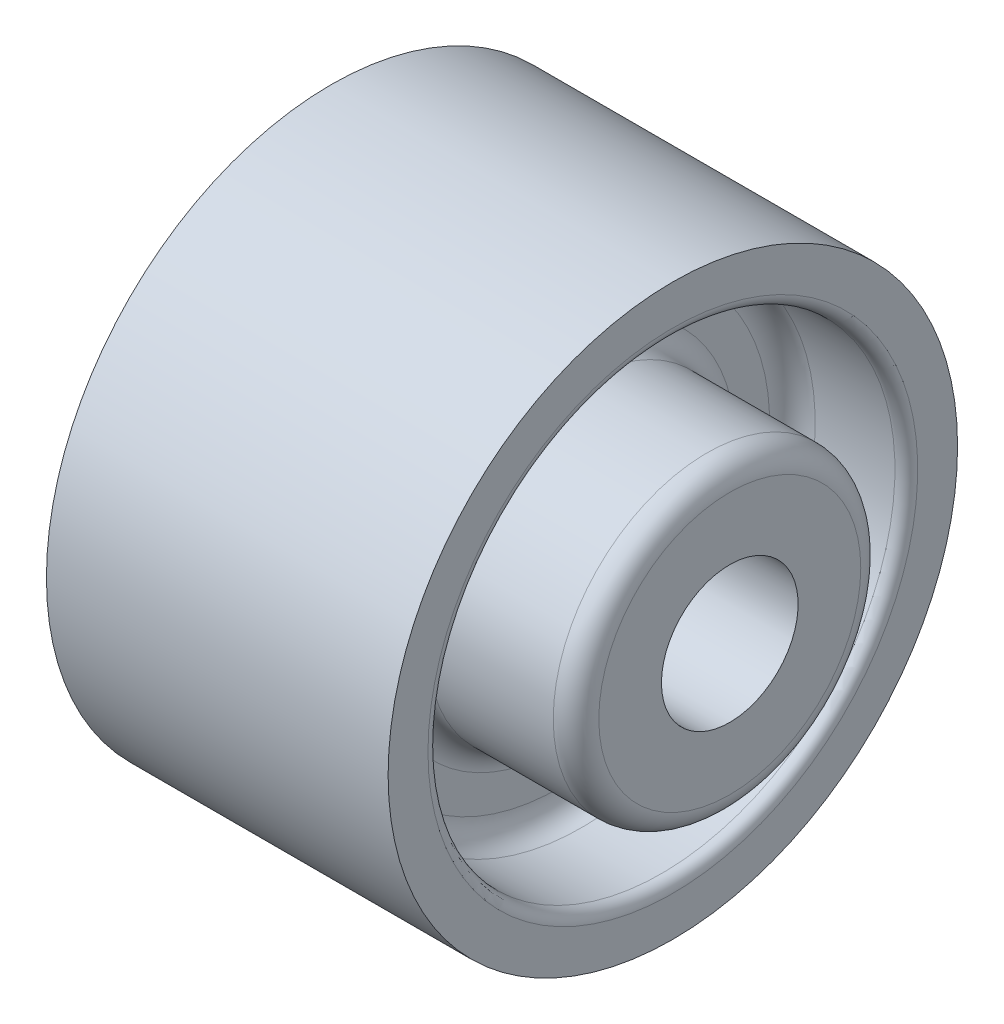
ISO-10303-21;
HEADER;
FILE_DESCRIPTION(('STEP AP214'),'2;1');
FILE_NAME('part.step','',(''),(''),'','','');
FILE_SCHEMA(('AUTOMOTIVE_DESIGN { 1 0 10303 214 1 1 1 1 }'));
ENDSEC;
DATA;
#1=APPLICATION_CONTEXT('core data for automotive mechanical design processes');
#2=APPLICATION_PROTOCOL_DEFINITION('international standard','automotive_design',2000,#1);
#3=PRODUCT_CONTEXT('',#1,'mechanical');
#4=PRODUCT('Part','Part','',(#3));
#5=PRODUCT_RELATED_PRODUCT_CATEGORY('part','',(#4));
#6=PRODUCT_DEFINITION_FORMATION('','',#4);
#7=PRODUCT_DEFINITION_CONTEXT('part definition',#1,'design');
#8=PRODUCT_DEFINITION('design','',#6,#7);
#9=PRODUCT_DEFINITION_SHAPE('','',#8);
#10=(LENGTH_UNIT() NAMED_UNIT(*) SI_UNIT(.MILLI.,.METRE.));
#11=(NAMED_UNIT(*) PLANE_ANGLE_UNIT() SI_UNIT($,.RADIAN.));
#12=(NAMED_UNIT(*) SI_UNIT($,.STERADIAN.) SOLID_ANGLE_UNIT());
#13=UNCERTAINTY_MEASURE_WITH_UNIT(LENGTH_MEASURE(1.E-05),#10,'distance_accuracy_value','');
#14=(GEOMETRIC_REPRESENTATION_CONTEXT(3) GLOBAL_UNCERTAINTY_ASSIGNED_CONTEXT((#13)) GLOBAL_UNIT_ASSIGNED_CONTEXT((#10,
#11,#12)) REPRESENTATION_CONTEXT('',''));
#15=CARTESIAN_POINT('',(0.,0.,0.));
#16=DIRECTION('',(0.,0.,1.));
#17=DIRECTION('',(1.,0.,0.));
#18=AXIS2_PLACEMENT_3D('',#15,#16,#17);
#19=CARTESIAN_POINT('',(-15.,25.,0.));
#20=DIRECTION('',(1.,0.,0.));
#21=DIRECTION('',(0.,0.,-1.));
#22=AXIS2_PLACEMENT_3D('',#19,#20,#21);
#23=PLANE('',#22);
#24=CARTESIAN_POINT('',(-15.,0.,0.));
#25=DIRECTION('',(-1.,0.,0.));
#26=DIRECTION('',(0.,0.,1.));
#27=AXIS2_PLACEMENT_3D('',#24,#25,#26);
#28=CIRCLE('',#27,21.5);
#29=CARTESIAN_POINT('',(-15.,0.,21.5));
#30=VERTEX_POINT('',#29);
#31=EDGE_CURVE('E10',#30,#30,#28,.T.);
#32=ORIENTED_EDGE('',*,*,#31,.F.);
#33=EDGE_LOOP('',(#32));
#34=FACE_BOUND('',#33,.T.);
#35=CARTESIAN_POINT('',(-15.,0.,0.));
#36=DIRECTION('',(-1.,0.,0.));
#37=DIRECTION('',(0.,0.,1.));
#38=AXIS2_PLACEMENT_3D('',#35,#36,#37);
#39=CIRCLE('',#38,25.);
#40=CARTESIAN_POINT('',(-15.,0.,25.));
#41=VERTEX_POINT('',#40);
#42=EDGE_CURVE('E96',#41,#41,#39,.T.);
#43=ORIENTED_EDGE('',*,*,#42,.T.);
#44=EDGE_LOOP('',(#43));
#45=FACE_BOUND('',#44,.T.);
#46=ADVANCED_FACE('F32',(#34,#45),#23,.F.);
#47=CARTESIAN_POINT('',(-14.,0.,0.));
#48=DIRECTION('',(-1.,0.,0.));
#49=DIRECTION('',(0.,0.,1.));
#50=AXIS2_PLACEMENT_3D('',#47,#48,#49);
#51=TOROIDAL_SURFACE('',#50,21.5,1.);
#52=CARTESIAN_POINT('',(-14.,0.,0.));
#53=DIRECTION('',(-1.,0.,0.));
#54=DIRECTION('',(0.,0.,1.));
#55=AXIS2_PLACEMENT_3D('',#52,#53,#54);
#56=CIRCLE('',#55,20.5);
#57=CARTESIAN_POINT('',(-14.,0.,20.5));
#58=VERTEX_POINT('',#57);
#59=EDGE_CURVE('E38',#58,#58,#56,.T.);
#60=ORIENTED_EDGE('',*,*,#59,.F.);
#61=EDGE_LOOP('',(#60));
#62=FACE_BOUND('',#61,.T.);
#63=ORIENTED_EDGE('',*,*,#31,.T.);
#64=EDGE_LOOP('',(#63));
#65=FACE_BOUND('',#64,.T.);
#66=ADVANCED_FACE('F205',(#62,#65),#51,.T.);
#67=CARTESIAN_POINT('',(-52.3821474865008,0.,0.));
#68=DIRECTION('',(-1.,0.,0.));
#69=DIRECTION('',(0.,0.,1.));
#70=AXIS2_PLACEMENT_3D('',#67,#68,#69);
#71=CYLINDRICAL_SURFACE('',#70,20.5);
#72=CARTESIAN_POINT('',(-7.38232719460137,0.,0.));
#73=DIRECTION('',(-1.,0.,0.));
#74=DIRECTION('',(0.,0.,1.));
#75=AXIS2_PLACEMENT_3D('',#72,#73,#74);
#76=CIRCLE('',#75,20.5);
#77=CARTESIAN_POINT('',(-7.38232719460137,0.,20.5));
#78=VERTEX_POINT('',#77);
#79=EDGE_CURVE('E42',#78,#78,#76,.T.);
#80=ORIENTED_EDGE('',*,*,#79,.F.);
#81=EDGE_LOOP('',(#80));
#82=FACE_BOUND('',#81,.T.);
#83=ORIENTED_EDGE('',*,*,#59,.T.);
#84=EDGE_LOOP('',(#83));
#85=FACE_BOUND('',#84,.T.);
#86=ADVANCED_FACE('F200',(#82,#85),#71,.F.);
#87=CARTESIAN_POINT('',(-7.38232719460137,0.,0.));
#88=DIRECTION('',(-1.,0.,0.));
#89=DIRECTION('',(0.,0.,1.));
#90=AXIS2_PLACEMENT_3D('',#87,#88,#89);
#91=TOROIDAL_SURFACE('',#90,18.5,2.);
#92=CARTESIAN_POINT('',(-5.41254255146046,0.,0.));
#93=DIRECTION('',(-1.,0.,0.));
#94=DIRECTION('',(0.,0.,1.));
#95=AXIS2_PLACEMENT_3D('',#92,#93,#94);
#96=CIRCLE('',#95,18.1536642385686);
#97=CARTESIAN_POINT('',(-5.41254255146046,0.,18.1536642385686));
#98=VERTEX_POINT('',#97);
#99=EDGE_CURVE('E46',#98,#98,#96,.T.);
#100=ORIENTED_EDGE('',*,*,#99,.F.);
#101=EDGE_LOOP('',(#100));
#102=FACE_BOUND('',#101,.T.);
#103=ORIENTED_EDGE('',*,*,#79,.T.);
#104=EDGE_LOOP('',(#103));
#105=FACE_BOUND('',#104,.T.);
#106=ADVANCED_FACE('F194',(#102,#105),#91,.F.);
#107=CARTESIAN_POINT('',(-5.41254255146046,0.,0.));
#108=DIRECTION('',(1.,0.,0.));
#109=DIRECTION('',(0.,0.,-1.));
#110=AXIS2_PLACEMENT_3D('',#107,#108,#109);
#111=CONICAL_SURFACE('',#110,18.1536642385686,1.39675108695216);
#112=CARTESIAN_POINT('',(-5.94001507893299,0.,0.));
#113=DIRECTION('',(-1.,0.,0.));
#114=DIRECTION('',(0.,0.,1.));
#115=AXIS2_PLACEMENT_3D('',#112,#113,#114);
#116=CIRCLE('',#115,15.1536642385686);
#117=CARTESIAN_POINT('',(-5.94001507893299,0.,15.1536642385686));
#118=VERTEX_POINT('',#117);
#119=EDGE_CURVE('E51',#118,#118,#116,.T.);
#120=ORIENTED_EDGE('',*,*,#119,.F.);
#121=EDGE_LOOP('',(#120));
#122=FACE_BOUND('',#121,.T.);
#123=ORIENTED_EDGE('',*,*,#99,.T.);
#124=EDGE_LOOP('',(#123));
#125=FACE_BOUND('',#124,.T.);
#126=ADVANCED_FACE('F188',(#122,#125),#111,.T.);
#127=CARTESIAN_POINT('',(-7.9097997220739,0.,0.));
#128=DIRECTION('',(-1.,0.,0.));
#129=DIRECTION('',(0.,0.,1.));
#130=AXIS2_PLACEMENT_3D('',#127,#128,#129);
#131=TOROIDAL_SURFACE('',#130,15.5,2.);
#132=CARTESIAN_POINT('',(-7.9097997220739,0.,0.));
#133=DIRECTION('',(-1.,0.,0.));
#134=DIRECTION('',(0.,0.,1.));
#135=AXIS2_PLACEMENT_3D('',#132,#133,#134);
#136=CIRCLE('',#135,13.5);
#137=CARTESIAN_POINT('',(-7.9097997220739,0.,13.5));
#138=VERTEX_POINT('',#137);
#139=EDGE_CURVE('E54',#138,#138,#136,.T.);
#140=ORIENTED_EDGE('',*,*,#139,.F.);
#141=EDGE_LOOP('',(#140));
#142=FACE_BOUND('',#141,.T.);
#143=ORIENTED_EDGE('',*,*,#119,.T.);
#144=EDGE_LOOP('',(#143));
#145=FACE_BOUND('',#144,.T.);
#146=ADVANCED_FACE('F182',(#142,#145),#131,.F.);
#147=CARTESIAN_POINT('',(-52.3821474865008,0.,0.));
#148=DIRECTION('',(-1.,0.,0.));
#149=DIRECTION('',(0.,0.,1.));
#150=AXIS2_PLACEMENT_3D('',#147,#148,#149);
#151=CYLINDRICAL_SURFACE('',#150,13.5);
#152=CARTESIAN_POINT('',(-18.,0.,0.));
#153=DIRECTION('',(-1.,0.,0.));
#154=DIRECTION('',(0.,0.,1.));
#155=AXIS2_PLACEMENT_3D('',#152,#153,#154);
#156=CIRCLE('',#155,13.5);
#157=CARTESIAN_POINT('',(-18.,0.,13.5));
#158=VERTEX_POINT('',#157);
#159=EDGE_CURVE('E57',#158,#158,#156,.T.);
#160=ORIENTED_EDGE('',*,*,#159,.F.);
#161=EDGE_LOOP('',(#160));
#162=FACE_BOUND('',#161,.T.);
#163=ORIENTED_EDGE('',*,*,#139,.T.);
#164=EDGE_LOOP('',(#163));
#165=FACE_BOUND('',#164,.T.);
#166=ADVANCED_FACE('F176',(#162,#165),#151,.T.);
#167=CARTESIAN_POINT('',(-18.,0.,0.));
#168=DIRECTION('',(-1.,0.,0.));
#169=DIRECTION('',(0.,0.,1.));
#170=AXIS2_PLACEMENT_3D('',#167,#168,#169);
#171=TOROIDAL_SURFACE('',#170,11.5,2.);
#172=CARTESIAN_POINT('',(-20.,0.,0.));
#173=DIRECTION('',(-1.,0.,0.));
#174=DIRECTION('',(0.,0.,1.));
#175=AXIS2_PLACEMENT_3D('',#172,#173,#174);
#176=CIRCLE('',#175,11.5);
#177=CARTESIAN_POINT('',(-20.,0.,11.5));
#178=VERTEX_POINT('',#177);
#179=EDGE_CURVE('E60',#178,#178,#176,.T.);
#180=ORIENTED_EDGE('',*,*,#179,.F.);
#181=EDGE_LOOP('',(#180));
#182=FACE_BOUND('',#181,.T.);
#183=ORIENTED_EDGE('',*,*,#159,.T.);
#184=EDGE_LOOP('',(#183));
#185=FACE_BOUND('',#184,.T.);
#186=ADVANCED_FACE('F170',(#182,#185),#171,.T.);
#187=CARTESIAN_POINT('',(-20.,11.5,0.));
#188=DIRECTION('',(1.,0.,0.));
#189=DIRECTION('',(0.,0.,-1.));
#190=AXIS2_PLACEMENT_3D('',#187,#188,#189);
#191=PLANE('',#190);
#192=CARTESIAN_POINT('',(-20.,0.,0.));
#193=DIRECTION('',(-1.,0.,0.));
#194=DIRECTION('',(0.,0.,1.));
#195=AXIS2_PLACEMENT_3D('',#192,#193,#194);
#196=CIRCLE('',#195,6.);
#197=CARTESIAN_POINT('',(-20.,0.,6.));
#198=VERTEX_POINT('',#197);
#199=EDGE_CURVE('E63',#198,#198,#196,.T.);
#200=ORIENTED_EDGE('',*,*,#199,.F.);
#201=EDGE_LOOP('',(#200));
#202=FACE_BOUND('',#201,.T.);
#203=ORIENTED_EDGE('',*,*,#179,.T.);
#204=EDGE_LOOP('',(#203));
#205=FACE_BOUND('',#204,.T.);
#206=ADVANCED_FACE('F164',(#202,#205),#191,.F.);
#207=CARTESIAN_POINT('',(-52.3821474865008,0.,0.));
#208=DIRECTION('',(-1.,0.,0.));
#209=DIRECTION('',(0.,0.,1.));
#210=AXIS2_PLACEMENT_3D('',#207,#208,#209);
#211=CYLINDRICAL_SURFACE('',#210,6.);
#212=CARTESIAN_POINT('',(20.,0.,0.));
#213=DIRECTION('',(-1.,0.,0.));
#214=DIRECTION('',(0.,0.,1.));
#215=AXIS2_PLACEMENT_3D('',#212,#213,#214);
#216=CIRCLE('',#215,6.);
#217=CARTESIAN_POINT('',(20.,0.,6.));
#218=VERTEX_POINT('',#217);
#219=EDGE_CURVE('E66',#218,#218,#216,.T.);
#220=ORIENTED_EDGE('',*,*,#219,.F.);
#221=EDGE_LOOP('',(#220));
#222=FACE_BOUND('',#221,.T.);
#223=ORIENTED_EDGE('',*,*,#199,.T.);
#224=EDGE_LOOP('',(#223));
#225=FACE_BOUND('',#224,.T.);
#226=ADVANCED_FACE('F158',(#222,#225),#211,.F.);
#227=CARTESIAN_POINT('',(20.,6.,0.));
#228=DIRECTION('',(-1.,0.,0.));
#229=DIRECTION('',(0.,0.,1.));
#230=AXIS2_PLACEMENT_3D('',#227,#228,#229);
#231=PLANE('',#230);
#232=CARTESIAN_POINT('',(20.,0.,0.));
#233=DIRECTION('',(-1.,0.,0.));
#234=DIRECTION('',(0.,0.,1.));
#235=AXIS2_PLACEMENT_3D('',#232,#233,#234);
#236=CIRCLE('',#235,11.5);
#237=CARTESIAN_POINT('',(20.,0.,11.5));
#238=VERTEX_POINT('',#237);
#239=EDGE_CURVE('E69',#238,#238,#236,.T.);
#240=ORIENTED_EDGE('',*,*,#239,.F.);
#241=EDGE_LOOP('',(#240));
#242=FACE_BOUND('',#241,.T.);
#243=ORIENTED_EDGE('',*,*,#219,.T.);
#244=EDGE_LOOP('',(#243));
#245=FACE_BOUND('',#244,.T.);
#246=ADVANCED_FACE('F152',(#242,#245),#231,.F.);
#247=CARTESIAN_POINT('',(18.,0.,0.));
#248=DIRECTION('',(-1.,0.,0.));
#249=DIRECTION('',(0.,0.,1.));
#250=AXIS2_PLACEMENT_3D('',#247,#248,#249);
#251=TOROIDAL_SURFACE('',#250,11.5,2.);
#252=CARTESIAN_POINT('',(18.,0.,0.));
#253=DIRECTION('',(-1.,0.,0.));
#254=DIRECTION('',(0.,0.,1.));
#255=AXIS2_PLACEMENT_3D('',#252,#253,#254);
#256=CIRCLE('',#255,13.5);
#257=CARTESIAN_POINT('',(18.,0.,13.5));
#258=VERTEX_POINT('',#257);
#259=EDGE_CURVE('E72',#258,#258,#256,.T.);
#260=ORIENTED_EDGE('',*,*,#259,.F.);
#261=EDGE_LOOP('',(#260));
#262=FACE_BOUND('',#261,.T.);
#263=ORIENTED_EDGE('',*,*,#239,.T.);
#264=EDGE_LOOP('',(#263));
#265=FACE_BOUND('',#264,.T.);
#266=ADVANCED_FACE('F146',(#262,#265),#251,.T.);
#267=CARTESIAN_POINT('',(-52.3821474865008,0.,0.));
#268=DIRECTION('',(-1.,0.,0.));
#269=DIRECTION('',(0.,0.,1.));
#270=AXIS2_PLACEMENT_3D('',#267,#268,#269);
#271=CYLINDRICAL_SURFACE('',#270,13.5);
#272=CARTESIAN_POINT('',(7.00000000000001,0.,0.));
#273=DIRECTION('',(-1.,0.,0.));
#274=DIRECTION('',(0.,0.,1.));
#275=AXIS2_PLACEMENT_3D('',#272,#273,#274);
#276=CIRCLE('',#275,13.5);
#277=CARTESIAN_POINT('',(7.00000000000001,0.,13.5));
#278=VERTEX_POINT('',#277);
#279=EDGE_CURVE('E75',#278,#278,#276,.T.);
#280=ORIENTED_EDGE('',*,*,#279,.F.);
#281=EDGE_LOOP('',(#280));
#282=FACE_BOUND('',#281,.T.);
#283=ORIENTED_EDGE('',*,*,#259,.T.);
#284=EDGE_LOOP('',(#283));
#285=FACE_BOUND('',#284,.T.);
#286=ADVANCED_FACE('F140',(#282,#285),#271,.T.);
#287=CARTESIAN_POINT('',(7.,0.,0.));
#288=DIRECTION('',(-1.,0.,0.));
#289=DIRECTION('',(0.,0.,1.));
#290=AXIS2_PLACEMENT_3D('',#287,#288,#289);
#291=TOROIDAL_SURFACE('',#290,15.5,2.);
#292=CARTESIAN_POINT('',(5.,0.,0.));
#293=DIRECTION('',(-1.,0.,0.));
#294=DIRECTION('',(0.,0.,1.));
#295=AXIS2_PLACEMENT_3D('',#292,#293,#294);
#296=CIRCLE('',#295,15.5);
#297=CARTESIAN_POINT('',(5.,0.,15.5));
#298=VERTEX_POINT('',#297);
#299=EDGE_CURVE('E78',#298,#298,#296,.T.);
#300=ORIENTED_EDGE('',*,*,#299,.F.);
#301=EDGE_LOOP('',(#300));
#302=FACE_BOUND('',#301,.T.);
#303=ORIENTED_EDGE('',*,*,#279,.T.);
#304=EDGE_LOOP('',(#303));
#305=FACE_BOUND('',#304,.T.);
#306=ADVANCED_FACE('F134',(#302,#305),#291,.F.);
#307=CARTESIAN_POINT('',(5.,15.5,0.));
#308=DIRECTION('',(-1.,0.,0.));
#309=DIRECTION('',(0.,0.,1.));
#310=AXIS2_PLACEMENT_3D('',#307,#308,#309);
#311=PLANE('',#310);
#312=CARTESIAN_POINT('',(5.,0.,0.));
#313=DIRECTION('',(-1.,0.,0.));
#314=DIRECTION('',(0.,0.,1.));
#315=AXIS2_PLACEMENT_3D('',#312,#313,#314);
#316=CIRCLE('',#315,18.5);
#317=CARTESIAN_POINT('',(5.,0.,18.5));
#318=VERTEX_POINT('',#317);
#319=EDGE_CURVE('E81',#318,#318,#316,.T.);
#320=ORIENTED_EDGE('',*,*,#319,.F.);
#321=EDGE_LOOP('',(#320));
#322=FACE_BOUND('',#321,.T.);
#323=ORIENTED_EDGE('',*,*,#299,.T.);
#324=EDGE_LOOP('',(#323));
#325=FACE_BOUND('',#324,.T.);
#326=ADVANCED_FACE('F128',(#322,#325),#311,.F.);
#327=CARTESIAN_POINT('',(7.,0.,0.));
#328=DIRECTION('',(-1.,0.,0.));
#329=DIRECTION('',(0.,0.,1.));
#330=AXIS2_PLACEMENT_3D('',#327,#328,#329);
#331=TOROIDAL_SURFACE('',#330,18.5,2.);
#332=CARTESIAN_POINT('',(7.,0.,0.));
#333=DIRECTION('',(-1.,0.,0.));
#334=DIRECTION('',(0.,0.,1.));
#335=AXIS2_PLACEMENT_3D('',#332,#333,#334);
#336=CIRCLE('',#335,20.5);
#337=CARTESIAN_POINT('',(7.,0.,20.5));
#338=VERTEX_POINT('',#337);
#339=EDGE_CURVE('E84',#338,#338,#336,.T.);
#340=ORIENTED_EDGE('',*,*,#339,.F.);
#341=EDGE_LOOP('',(#340));
#342=FACE_BOUND('',#341,.T.);
#343=ORIENTED_EDGE('',*,*,#319,.T.);
#344=EDGE_LOOP('',(#343));
#345=FACE_BOUND('',#344,.T.);
#346=ADVANCED_FACE('F122',(#342,#345),#331,.F.);
#347=CARTESIAN_POINT('',(-52.3821474865008,0.,0.));
#348=DIRECTION('',(-1.,0.,0.));
#349=DIRECTION('',(0.,0.,1.));
#350=AXIS2_PLACEMENT_3D('',#347,#348,#349);
#351=CYLINDRICAL_SURFACE('',#350,20.5);
#352=CARTESIAN_POINT('',(14.,0.,0.));
#353=DIRECTION('',(-1.,0.,0.));
#354=DIRECTION('',(0.,0.,1.));
#355=AXIS2_PLACEMENT_3D('',#352,#353,#354);
#356=CIRCLE('',#355,20.5);
#357=CARTESIAN_POINT('',(14.,0.,20.5));
#358=VERTEX_POINT('',#357);
#359=EDGE_CURVE('E87',#358,#358,#356,.T.);
#360=ORIENTED_EDGE('',*,*,#359,.F.);
#361=EDGE_LOOP('',(#360));
#362=FACE_BOUND('',#361,.T.);
#363=ORIENTED_EDGE('',*,*,#339,.T.);
#364=EDGE_LOOP('',(#363));
#365=FACE_BOUND('',#364,.T.);
#366=ADVANCED_FACE('F116',(#362,#365),#351,.F.);
#367=CARTESIAN_POINT('',(14.,0.,0.));
#368=DIRECTION('',(-1.,0.,0.));
#369=DIRECTION('',(0.,0.,1.));
#370=AXIS2_PLACEMENT_3D('',#367,#368,#369);
#371=TOROIDAL_SURFACE('',#370,21.5,1.);
#372=CARTESIAN_POINT('',(15.,0.,0.));
#373=DIRECTION('',(-1.,0.,0.));
#374=DIRECTION('',(0.,0.,1.));
#375=AXIS2_PLACEMENT_3D('',#372,#373,#374);
#376=CIRCLE('',#375,21.5);
#377=CARTESIAN_POINT('',(15.,0.,21.5));
#378=VERTEX_POINT('',#377);
#379=EDGE_CURVE('E90',#378,#378,#376,.T.);
#380=ORIENTED_EDGE('',*,*,#379,.F.);
#381=EDGE_LOOP('',(#380));
#382=FACE_BOUND('',#381,.T.);
#383=ORIENTED_EDGE('',*,*,#359,.T.);
#384=EDGE_LOOP('',(#383));
#385=FACE_BOUND('',#384,.T.);
#386=ADVANCED_FACE('F110',(#382,#385),#371,.T.);
#387=CARTESIAN_POINT('',(15.,21.5,0.));
#388=DIRECTION('',(-1.,0.,0.));
#389=DIRECTION('',(0.,0.,1.));
#390=AXIS2_PLACEMENT_3D('',#387,#388,#389);
#391=PLANE('',#390);
#392=CARTESIAN_POINT('',(15.,0.,0.));
#393=DIRECTION('',(-1.,0.,0.));
#394=DIRECTION('',(0.,0.,1.));
#395=AXIS2_PLACEMENT_3D('',#392,#393,#394);
#396=CIRCLE('',#395,25.);
#397=CARTESIAN_POINT('',(15.,0.,25.));
#398=VERTEX_POINT('',#397);
#399=EDGE_CURVE('E93',#398,#398,#396,.T.);
#400=ORIENTED_EDGE('',*,*,#399,.F.);
#401=EDGE_LOOP('',(#400));
#402=FACE_BOUND('',#401,.T.);
#403=ORIENTED_EDGE('',*,*,#379,.T.);
#404=EDGE_LOOP('',(#403));
#405=FACE_BOUND('',#404,.T.);
#406=ADVANCED_FACE('F104',(#402,#405),#391,.F.);
#407=CARTESIAN_POINT('',(-52.3821474865008,0.,0.));
#408=DIRECTION('',(-1.,0.,0.));
#409=DIRECTION('',(0.,0.,1.));
#410=AXIS2_PLACEMENT_3D('',#407,#408,#409);
#411=CYLINDRICAL_SURFACE('',#410,25.);
#412=ORIENTED_EDGE('',*,*,#42,.F.);
#413=EDGE_LOOP('',(#412));
#414=FACE_BOUND('',#413,.T.);
#415=ORIENTED_EDGE('',*,*,#399,.T.);
#416=EDGE_LOOP('',(#415));
#417=FACE_BOUND('',#416,.T.);
#418=ADVANCED_FACE('F101',(#414,#417),#411,.T.);
#419=CLOSED_SHELL('',(#46,#66,#86,#106,#126,#146,#166,#186,#206,#226,#246,#266,#286,#306,#326,
#346,#366,#386,#406,#418));
#420=MANIFOLD_SOLID_BREP('B2',#419);
#421=ADVANCED_BREP_SHAPE_REPRESENTATION('',(#18,#420),#14);
#422=SHAPE_DEFINITION_REPRESENTATION(#9,#421);
ENDSEC;
END-ISO-10303-21;
